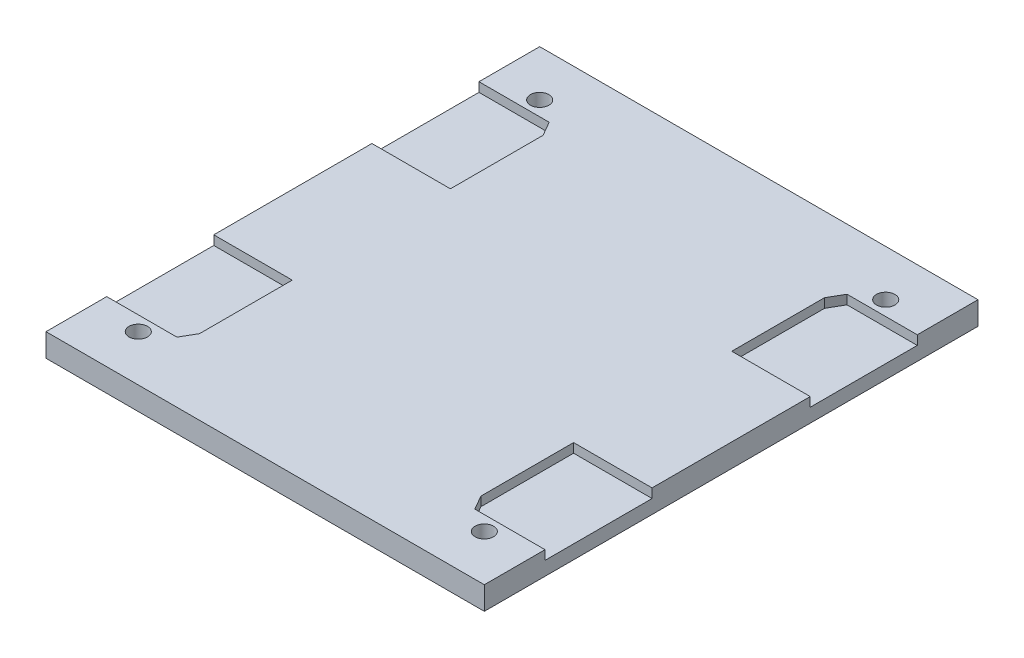
ISO-10303-21;
HEADER;
FILE_DESCRIPTION(('STEP AP214'),'2;1');
FILE_NAME('part.step','',(''),(''),'','','');
FILE_SCHEMA(('AUTOMOTIVE_DESIGN { 1 0 10303 214 1 1 1 1 }'));
ENDSEC;
DATA;
#1=APPLICATION_CONTEXT('core data for automotive mechanical design processes');
#2=APPLICATION_PROTOCOL_DEFINITION('international standard','automotive_design',2000,#1);
#3=PRODUCT_CONTEXT('',#1,'mechanical');
#4=PRODUCT('Part','Part','',(#3));
#5=PRODUCT_RELATED_PRODUCT_CATEGORY('part','',(#4));
#6=PRODUCT_DEFINITION_FORMATION('','',#4);
#7=PRODUCT_DEFINITION_CONTEXT('part definition',#1,'design');
#8=PRODUCT_DEFINITION('design','',#6,#7);
#9=PRODUCT_DEFINITION_SHAPE('','',#8);
#10=(LENGTH_UNIT() NAMED_UNIT(*) SI_UNIT(.MILLI.,.METRE.));
#11=(NAMED_UNIT(*) PLANE_ANGLE_UNIT() SI_UNIT($,.RADIAN.));
#12=(NAMED_UNIT(*) SI_UNIT($,.STERADIAN.) SOLID_ANGLE_UNIT());
#13=UNCERTAINTY_MEASURE_WITH_UNIT(LENGTH_MEASURE(1.E-05),#10,'distance_accuracy_value','');
#14=(GEOMETRIC_REPRESENTATION_CONTEXT(3) GLOBAL_UNCERTAINTY_ASSIGNED_CONTEXT((#13)) GLOBAL_UNIT_ASSIGNED_CONTEXT((#10,
#11,#12)) REPRESENTATION_CONTEXT('',''));
#15=CARTESIAN_POINT('',(0.,0.,0.));
#16=DIRECTION('',(0.,0.,1.));
#17=DIRECTION('',(1.,0.,0.));
#18=AXIS2_PLACEMENT_3D('',#15,#16,#17);
#19=CARTESIAN_POINT('',(47.5,5.,0.));
#20=DIRECTION('',(-1.,0.,0.));
#21=DIRECTION('',(0.,0.,1.));
#22=AXIS2_PLACEMENT_3D('',#19,#20,#21);
#23=PLANE('',#22);
#24=DIRECTION('',(0.,1.,0.));
#25=VECTOR('',#24,1.);
#26=CARTESIAN_POINT('',(47.5,3.,40.337063088207));
#27=LINE('',#26,#25);
#28=CARTESIAN_POINT('',(47.5,3.,40.337063088207));
#29=VERTEX_POINT('',#28);
#30=CARTESIAN_POINT('',(47.5,5.,40.337063088207));
#31=VERTEX_POINT('',#30);
#32=EDGE_CURVE('E249',#29,#31,#27,.T.);
#33=ORIENTED_EDGE('',*,*,#32,.T.);
#34=DIRECTION('',(0.,0.,-1.));
#35=VECTOR('',#34,1.);
#36=CARTESIAN_POINT('',(47.5,5.,0.));
#37=LINE('',#36,#35);
#38=CARTESIAN_POINT('',(47.5,5.,53.5));
#39=VERTEX_POINT('',#38);
#40=EDGE_CURVE('E348',#39,#31,#37,.T.);
#41=ORIENTED_EDGE('',*,*,#40,.F.);
#42=DIRECTION('',(0.,-1.,0.));
#43=VECTOR('',#42,1.);
#44=CARTESIAN_POINT('',(47.5,5.,53.5));
#45=LINE('',#44,#43);
#46=CARTESIAN_POINT('',(47.5,0.,53.5));
#47=VERTEX_POINT('',#46);
#48=EDGE_CURVE('E11',#39,#47,#45,.T.);
#49=ORIENTED_EDGE('',*,*,#48,.T.);
#50=DIRECTION('',(0.,0.,-1.));
#51=VECTOR('',#50,1.);
#52=CARTESIAN_POINT('',(47.5,0.,0.));
#53=LINE('',#52,#51);
#54=CARTESIAN_POINT('',(47.5,0.,-53.5));
#55=VERTEX_POINT('',#54);
#56=EDGE_CURVE('E375',#47,#55,#53,.T.);
#57=ORIENTED_EDGE('',*,*,#56,.T.);
#58=DIRECTION('',(0.,-1.,0.));
#59=VECTOR('',#58,1.);
#60=CARTESIAN_POINT('',(47.5,5.,-53.5));
#61=LINE('',#60,#59);
#62=CARTESIAN_POINT('',(47.5,5.,-53.5));
#63=VERTEX_POINT('',#62);
#64=EDGE_CURVE('E46',#63,#55,#61,.T.);
#65=ORIENTED_EDGE('',*,*,#64,.F.);
#66=CARTESIAN_POINT('',(47.5,5.,-40.337063088207));
#67=VERTEX_POINT('',#66);
#68=EDGE_CURVE('E226',#67,#63,#37,.T.);
#69=ORIENTED_EDGE('',*,*,#68,.F.);
#70=DIRECTION('',(0.,1.,0.));
#71=VECTOR('',#70,1.);
#72=CARTESIAN_POINT('',(47.5,3.,-40.337063088207));
#73=LINE('',#72,#71);
#74=CARTESIAN_POINT('',(47.5,3.,-40.337063088207));
#75=VERTEX_POINT('',#74);
#76=EDGE_CURVE('E205',#75,#67,#73,.T.);
#77=ORIENTED_EDGE('',*,*,#76,.F.);
#78=DIRECTION('',(0.,0.,-1.));
#79=VECTOR('',#78,1.);
#80=CARTESIAN_POINT('',(47.5,3.,0.));
#81=LINE('',#80,#79);
#82=CARTESIAN_POINT('',(47.5,3.,-17.1401594634259));
#83=VERTEX_POINT('',#82);
#84=EDGE_CURVE('E212',#83,#75,#81,.T.);
#85=ORIENTED_EDGE('',*,*,#84,.F.);
#86=DIRECTION('',(0.,1.,0.));
#87=VECTOR('',#86,1.);
#88=CARTESIAN_POINT('',(47.5,3.,-17.1401594634259));
#89=LINE('',#88,#87);
#90=CARTESIAN_POINT('',(47.5,5.,-17.1401594634259));
#91=VERTEX_POINT('',#90);
#92=EDGE_CURVE('E325',#83,#91,#89,.T.);
#93=ORIENTED_EDGE('',*,*,#92,.T.);
#94=CARTESIAN_POINT('',(47.5,5.,17.1401594634259));
#95=VERTEX_POINT('',#94);
#96=EDGE_CURVE('E352',#95,#91,#37,.T.);
#97=ORIENTED_EDGE('',*,*,#96,.F.);
#98=DIRECTION('',(0.,1.,0.));
#99=VECTOR('',#98,1.);
#100=CARTESIAN_POINT('',(47.5,3.,17.1401594634259));
#101=LINE('',#100,#99);
#102=CARTESIAN_POINT('',(47.5,3.,17.1401594634259));
#103=VERTEX_POINT('',#102);
#104=EDGE_CURVE('E270',#103,#95,#101,.T.);
#105=ORIENTED_EDGE('',*,*,#104,.F.);
#106=DIRECTION('',(0.,0.,-1.));
#107=VECTOR('',#106,1.);
#108=CARTESIAN_POINT('',(47.5,3.,0.));
#109=LINE('',#108,#107);
#110=EDGE_CURVE('E237',#29,#103,#109,.T.);
#111=ORIENTED_EDGE('',*,*,#110,.F.);
#112=EDGE_LOOP('',(#33,#41,#49,#57,#65,#69,#77,#85,#93,#97,#105,#111));
#113=FACE_BOUND('',#112,.T.);
#114=ADVANCED_FACE('F38',(#113),#23,.F.);
#115=CARTESIAN_POINT('',(-47.5,5.,0.));
#116=DIRECTION('',(-1.,0.,0.));
#117=DIRECTION('',(0.,0.,1.));
#118=AXIS2_PLACEMENT_3D('',#115,#116,#117);
#119=PLANE('',#118);
#120=DIRECTION('',(0.,0.,1.));
#121=VECTOR('',#120,1.);
#122=CARTESIAN_POINT('',(-47.5,3.,0.));
#123=LINE('',#122,#121);
#124=CARTESIAN_POINT('',(-47.5,3.,17.1401594634259));
#125=VERTEX_POINT('',#124);
#126=CARTESIAN_POINT('',(-47.5,3.,40.3370630882075));
#127=VERTEX_POINT('',#126);
#128=EDGE_CURVE('E276',#125,#127,#123,.T.);
#129=ORIENTED_EDGE('',*,*,#128,.F.);
#130=DIRECTION('',(0.,1.,0.));
#131=VECTOR('',#130,1.);
#132=CARTESIAN_POINT('',(-47.5,3.,17.1401594634259));
#133=LINE('',#132,#131);
#134=CARTESIAN_POINT('',(-47.5,5.,17.1401594634259));
#135=VERTEX_POINT('',#134);
#136=EDGE_CURVE('E288',#125,#135,#133,.T.);
#137=ORIENTED_EDGE('',*,*,#136,.T.);
#138=DIRECTION('',(0.,0.,-1.));
#139=VECTOR('',#138,1.);
#140=CARTESIAN_POINT('',(-47.5,5.,0.));
#141=LINE('',#140,#139);
#142=CARTESIAN_POINT('',(-47.5,5.,-17.1401594634259));
#143=VERTEX_POINT('',#142);
#144=EDGE_CURVE('E360',#135,#143,#141,.T.);
#145=ORIENTED_EDGE('',*,*,#144,.T.);
#146=DIRECTION('',(0.,1.,0.));
#147=VECTOR('',#146,1.);
#148=CARTESIAN_POINT('',(-47.5,3.,-17.1401594634259));
#149=LINE('',#148,#147);
#150=CARTESIAN_POINT('',(-47.5,3.,-17.1401594634259));
#151=VERTEX_POINT('',#150);
#152=EDGE_CURVE('E53',#151,#143,#149,.T.);
#153=ORIENTED_EDGE('',*,*,#152,.F.);
#154=DIRECTION('',(0.,0.,1.));
#155=VECTOR('',#154,1.);
#156=CARTESIAN_POINT('',(-47.5,3.,0.));
#157=LINE('',#156,#155);
#158=CARTESIAN_POINT('',(-47.5,3.,-40.3370630882075));
#159=VERTEX_POINT('',#158);
#160=EDGE_CURVE('E308',#159,#151,#157,.T.);
#161=ORIENTED_EDGE('',*,*,#160,.F.);
#162=DIRECTION('',(0.,1.,0.));
#163=VECTOR('',#162,1.);
#164=CARTESIAN_POINT('',(-47.5,3.,-40.3370630882075));
#165=LINE('',#164,#163);
#166=CARTESIAN_POINT('',(-47.5,5.,-40.3370630882075));
#167=VERTEX_POINT('',#166);
#168=EDGE_CURVE('E333',#159,#167,#165,.T.);
#169=ORIENTED_EDGE('',*,*,#168,.T.);
#170=CARTESIAN_POINT('',(-47.5,5.,-53.5));
#171=VERTEX_POINT('',#170);
#172=EDGE_CURVE('E355',#167,#171,#141,.T.);
#173=ORIENTED_EDGE('',*,*,#172,.T.);
#174=DIRECTION('',(0.,-1.,0.));
#175=VECTOR('',#174,1.);
#176=CARTESIAN_POINT('',(-47.5,5.,-53.5));
#177=LINE('',#176,#175);
#178=CARTESIAN_POINT('',(-47.5,0.,-53.5));
#179=VERTEX_POINT('',#178);
#180=EDGE_CURVE('E396',#171,#179,#177,.T.);
#181=ORIENTED_EDGE('',*,*,#180,.T.);
#182=DIRECTION('',(0.,0.,-1.));
#183=VECTOR('',#182,1.);
#184=CARTESIAN_POINT('',(-47.5,0.,0.));
#185=LINE('',#184,#183);
#186=CARTESIAN_POINT('',(-47.5,0.,53.5));
#187=VERTEX_POINT('',#186);
#188=EDGE_CURVE('E381',#187,#179,#185,.T.);
#189=ORIENTED_EDGE('',*,*,#188,.F.);
#190=DIRECTION('',(0.,-1.,0.));
#191=VECTOR('',#190,1.);
#192=CARTESIAN_POINT('',(-47.5,5.,53.5));
#193=LINE('',#192,#191);
#194=CARTESIAN_POINT('',(-47.5,5.,53.5));
#195=VERTEX_POINT('',#194);
#196=EDGE_CURVE('E372',#195,#187,#193,.T.);
#197=ORIENTED_EDGE('',*,*,#196,.F.);
#198=CARTESIAN_POINT('',(-47.5,5.,40.3370630882075));
#199=VERTEX_POINT('',#198);
#200=EDGE_CURVE('E356',#195,#199,#141,.T.);
#201=ORIENTED_EDGE('',*,*,#200,.T.);
#202=DIRECTION('',(0.,1.,0.));
#203=VECTOR('',#202,1.);
#204=CARTESIAN_POINT('',(-47.5,3.,40.3370630882075));
#205=LINE('',#204,#203);
#206=EDGE_CURVE('E61',#127,#199,#205,.T.);
#207=ORIENTED_EDGE('',*,*,#206,.F.);
#208=EDGE_LOOP('',(#129,#137,#145,#153,#161,#169,#173,#181,#189,#197,#201,#207));
#209=FACE_BOUND('',#208,.T.);
#210=ADVANCED_FACE('F410',(#209),#119,.T.);
#211=CARTESIAN_POINT('',(0.,5.,0.));
#212=DIRECTION('',(0.,1.,0.));
#213=DIRECTION('',(0.,0.,1.));
#214=AXIS2_PLACEMENT_3D('',#211,#212,#213);
#215=PLANE('',#214);
#216=CARTESIAN_POINT('',(-37.5,5.,-43.5));
#217=DIRECTION('',(0.,1.,0.));
#218=DIRECTION('',(0.,0.,1.));
#219=AXIS2_PLACEMENT_3D('',#216,#217,#218);
#220=CIRCLE('',#219,2.);
#221=CARTESIAN_POINT('',(-37.5,5.,-41.5));
#222=VERTEX_POINT('',#221);
#223=EDGE_CURVE('E359',#222,#222,#220,.T.);
#224=ORIENTED_EDGE('',*,*,#223,.F.);
#225=EDGE_LOOP('',(#224));
#226=FACE_BOUND('',#225,.T.);
#227=CARTESIAN_POINT('',(37.5,5.,-43.5));
#228=DIRECTION('',(0.,1.,0.));
#229=DIRECTION('',(0.,0.,1.));
#230=AXIS2_PLACEMENT_3D('',#227,#228,#229);
#231=CIRCLE('',#230,2.);
#232=CARTESIAN_POINT('',(37.5,5.,-41.5));
#233=VERTEX_POINT('',#232);
#234=EDGE_CURVE('E363',#233,#233,#231,.F.);
#235=ORIENTED_EDGE('',*,*,#234,.T.);
#236=EDGE_LOOP('',(#235));
#237=FACE_BOUND('',#236,.T.);
#238=CARTESIAN_POINT('',(37.5,5.,43.5));
#239=DIRECTION('',(0.,1.,0.));
#240=DIRECTION('',(0.,0.,1.));
#241=AXIS2_PLACEMENT_3D('',#238,#239,#240);
#242=CIRCLE('',#241,2.);
#243=CARTESIAN_POINT('',(37.5,5.,45.5));
#244=VERTEX_POINT('',#243);
#245=EDGE_CURVE('E366',#244,#244,#242,.T.);
#246=ORIENTED_EDGE('',*,*,#245,.F.);
#247=EDGE_LOOP('',(#246));
#248=FACE_BOUND('',#247,.T.);
#249=CARTESIAN_POINT('',(-37.5,5.,43.5));
#250=DIRECTION('',(0.,1.,0.));
#251=DIRECTION('',(0.,0.,1.));
#252=AXIS2_PLACEMENT_3D('',#249,#250,#251);
#253=CIRCLE('',#252,2.);
#254=CARTESIAN_POINT('',(-37.5,5.,45.5));
#255=VERTEX_POINT('',#254);
#256=EDGE_CURVE('E369',#255,#255,#253,.F.);
#257=ORIENTED_EDGE('',*,*,#256,.T.);
#258=EDGE_LOOP('',(#257));
#259=FACE_BOUND('',#258,.T.);
#260=ORIENTED_EDGE('',*,*,#144,.F.);
#261=DIRECTION('',(1.,0.,0.));
#262=VECTOR('',#261,1.);
#263=CARTESIAN_POINT('',(0.,5.,17.1401594634259));
#264=LINE('',#263,#262);
#265=CARTESIAN_POINT('',(-30.489963443197,5.,17.1401594634259));
#266=VERTEX_POINT('',#265);
#267=EDGE_CURVE('E289',#135,#266,#264,.T.);
#268=ORIENTED_EDGE('',*,*,#267,.T.);
#269=DIRECTION('',(0.,0.,1.));
#270=VECTOR('',#269,1.);
#271=CARTESIAN_POINT('',(-30.489963443197,5.,0.));
#272=LINE('',#271,#270);
#273=CARTESIAN_POINT('',(-30.489963443197,5.,37.232769094159));
#274=VERTEX_POINT('',#273);
#275=EDGE_CURVE('E277',#266,#274,#272,.T.);
#276=ORIENTED_EDGE('',*,*,#275,.T.);
#277=DIRECTION('',(0.500000000000003,0.,-0.866025403784437));
#278=VECTOR('',#277,1.);
#279=CARTESIAN_POINT('',(-6.74521063800667,5.,-3.8943491775939));
#280=LINE('',#279,#278);
#281=CARTESIAN_POINT('',(-32.2822284162783,5.,40.337063088162));
#282=VERTEX_POINT('',#281);
#283=EDGE_CURVE('E294',#282,#274,#280,.T.);
#284=ORIENTED_EDGE('',*,*,#283,.F.);
#285=DIRECTION('',(1.,0.,-5.93878153770729E-12));
#286=VECTOR('',#285,1.);
#287=CARTESIAN_POINT('',(2.39553005552172E-10,5.,40.3370630879703));
#288=LINE('',#287,#286);
#289=EDGE_CURVE('E292',#199,#282,#288,.T.);
#290=ORIENTED_EDGE('',*,*,#289,.F.);
#291=ORIENTED_EDGE('',*,*,#200,.F.);
#292=DIRECTION('',(1.,0.,0.));
#293=VECTOR('',#292,1.);
#294=CARTESIAN_POINT('',(0.,5.,53.5));
#295=LINE('',#294,#293);
#296=EDGE_CURVE('E344',#195,#39,#295,.T.);
#297=ORIENTED_EDGE('',*,*,#296,.T.);
#298=ORIENTED_EDGE('',*,*,#40,.T.);
#299=DIRECTION('',(-1.,0.,-5.96188434918114E-12));
#300=VECTOR('',#299,1.);
#301=CARTESIAN_POINT('',(-2.40484905116095E-10,5.,40.3370630879691));
#302=LINE('',#301,#300);
#303=CARTESIAN_POINT('',(32.2822284163111,5.,40.3370630881616));
#304=VERTEX_POINT('',#303);
#305=EDGE_CURVE('E250',#31,#304,#302,.T.);
#306=ORIENTED_EDGE('',*,*,#305,.T.);
#307=DIRECTION('',(-0.5,0.,-0.866025403784439));
#308=VECTOR('',#307,1.);
#309=CARTESIAN_POINT('',(6.74521063803161,5.,-3.89434917760827));
#310=LINE('',#309,#308);
#311=CARTESIAN_POINT('',(30.48996344323,5.,37.232769094159));
#312=VERTEX_POINT('',#311);
#313=EDGE_CURVE('E238',#304,#312,#310,.T.);
#314=ORIENTED_EDGE('',*,*,#313,.T.);
#315=DIRECTION('',(0.,0.,1.));
#316=VECTOR('',#315,1.);
#317=CARTESIAN_POINT('',(30.48996344323,5.,0.));
#318=LINE('',#317,#316);
#319=CARTESIAN_POINT('',(30.48996344323,5.,17.1401594634259));
#320=VERTEX_POINT('',#319);
#321=EDGE_CURVE('E257',#320,#312,#318,.T.);
#322=ORIENTED_EDGE('',*,*,#321,.F.);
#323=DIRECTION('',(-1.,0.,0.));
#324=VECTOR('',#323,1.);
#325=CARTESIAN_POINT('',(0.,5.,17.1401594634259));
#326=LINE('',#325,#324);
#327=EDGE_CURVE('E253',#95,#320,#326,.T.);
#328=ORIENTED_EDGE('',*,*,#327,.F.);
#329=ORIENTED_EDGE('',*,*,#96,.T.);
#330=DIRECTION('',(-1.,0.,0.));
#331=VECTOR('',#330,1.);
#332=CARTESIAN_POINT('',(0.,5.,-17.1401594634259));
#333=LINE('',#332,#331);
#334=CARTESIAN_POINT('',(30.48996344323,5.,-17.1401594634259));
#335=VERTEX_POINT('',#334);
#336=EDGE_CURVE('E221',#91,#335,#333,.T.);
#337=ORIENTED_EDGE('',*,*,#336,.T.);
#338=DIRECTION('',(0.,0.,-1.));
#339=VECTOR('',#338,1.);
#340=CARTESIAN_POINT('',(30.48996344323,5.,0.));
#341=LINE('',#340,#339);
#342=CARTESIAN_POINT('',(30.48996344323,5.,-37.232769094159));
#343=VERTEX_POINT('',#342);
#344=EDGE_CURVE('E437',#335,#343,#341,.T.);
#345=ORIENTED_EDGE('',*,*,#344,.T.);
#346=DIRECTION('',(-0.5,0.,0.866025403784439));
#347=VECTOR('',#346,1.);
#348=CARTESIAN_POINT('',(6.74521063803161,5.,3.89434917760827));
#349=LINE('',#348,#347);
#350=CARTESIAN_POINT('',(32.2822284163111,5.,-40.3370630881616));
#351=VERTEX_POINT('',#350);
#352=EDGE_CURVE('E439',#351,#343,#349,.T.);
#353=ORIENTED_EDGE('',*,*,#352,.F.);
#354=DIRECTION('',(-1.,0.,5.96188434918114E-12));
#355=VECTOR('',#354,1.);
#356=CARTESIAN_POINT('',(-2.40484905116095E-10,5.,-40.3370630879691));
#357=LINE('',#356,#355);
#358=EDGE_CURVE('E265',#67,#351,#357,.T.);
#359=ORIENTED_EDGE('',*,*,#358,.F.);
#360=ORIENTED_EDGE('',*,*,#68,.T.);
#361=DIRECTION('',(1.,0.,0.));
#362=VECTOR('',#361,1.);
#363=CARTESIAN_POINT('',(0.,5.,-53.5));
#364=LINE('',#363,#362);
#365=EDGE_CURVE('E351',#171,#63,#364,.T.);
#366=ORIENTED_EDGE('',*,*,#365,.F.);
#367=ORIENTED_EDGE('',*,*,#172,.F.);
#368=DIRECTION('',(1.,0.,5.93878153770729E-12));
#369=VECTOR('',#368,1.);
#370=CARTESIAN_POINT('',(2.39553005552172E-10,5.,-40.3370630879703));
#371=LINE('',#370,#369);
#372=CARTESIAN_POINT('',(-32.2822284162783,5.,-40.337063088162));
#373=VERTEX_POINT('',#372);
#374=EDGE_CURVE('E312',#167,#373,#371,.T.);
#375=ORIENTED_EDGE('',*,*,#374,.T.);
#376=DIRECTION('',(0.500000000000003,0.,0.866025403784437));
#377=VECTOR('',#376,1.);
#378=CARTESIAN_POINT('',(-6.74521063800667,5.,3.8943491775939));
#379=LINE('',#378,#377);
#380=CARTESIAN_POINT('',(-30.489963443197,5.,-37.232769094159));
#381=VERTEX_POINT('',#380);
#382=EDGE_CURVE('E328',#373,#381,#379,.T.);
#383=ORIENTED_EDGE('',*,*,#382,.T.);
#384=DIRECTION('',(0.,0.,-1.));
#385=VECTOR('',#384,1.);
#386=CARTESIAN_POINT('',(-30.489963443197,5.,0.));
#387=LINE('',#386,#385);
#388=CARTESIAN_POINT('',(-30.489963443197,5.,-17.1401594634259));
#389=VERTEX_POINT('',#388);
#390=EDGE_CURVE('E324',#389,#381,#387,.T.);
#391=ORIENTED_EDGE('',*,*,#390,.F.);
#392=DIRECTION('',(1.,0.,0.));
#393=VECTOR('',#392,1.);
#394=CARTESIAN_POINT('',(0.,5.,-17.1401594634259));
#395=LINE('',#394,#393);
#396=EDGE_CURVE('E322',#143,#389,#395,.T.);
#397=ORIENTED_EDGE('',*,*,#396,.F.);
#398=EDGE_LOOP('',(#260,#268,#276,#284,#290,#291,#297,#298,#306,#314,#322,#328,#329,#337,#345,
#353,#359,#360,#366,#367,#375,#383,#391,#397));
#399=FACE_BOUND('',#398,.T.);
#400=ADVANCED_FACE('F415',(#226,#237,#248,#259,#399),#215,.T.);
#401=CARTESIAN_POINT('',(0.,5.,53.5));
#402=DIRECTION('',(0.,0.,-1.));
#403=DIRECTION('',(-1.,0.,0.));
#404=AXIS2_PLACEMENT_3D('',#401,#402,#403);
#405=PLANE('',#404);
#406=DIRECTION('',(1.,0.,0.));
#407=VECTOR('',#406,1.);
#408=CARTESIAN_POINT('',(0.,0.,53.5));
#409=LINE('',#408,#407);
#410=EDGE_CURVE('E336',#187,#47,#409,.T.);
#411=ORIENTED_EDGE('',*,*,#410,.T.);
#412=ORIENTED_EDGE('',*,*,#48,.F.);
#413=ORIENTED_EDGE('',*,*,#296,.F.);
#414=ORIENTED_EDGE('',*,*,#196,.T.);
#415=EDGE_LOOP('',(#411,#412,#413,#414));
#416=FACE_BOUND('',#415,.T.);
#417=ADVANCED_FACE('F40',(#416),#405,.F.);
#418=CARTESIAN_POINT('',(0.,5.,-53.5));
#419=DIRECTION('',(0.,0.,-1.));
#420=DIRECTION('',(-1.,0.,0.));
#421=AXIS2_PLACEMENT_3D('',#418,#419,#420);
#422=PLANE('',#421);
#423=DIRECTION('',(1.,0.,0.));
#424=VECTOR('',#423,1.);
#425=CARTESIAN_POINT('',(0.,0.,-53.5));
#426=LINE('',#425,#424);
#427=EDGE_CURVE('E378',#179,#55,#426,.T.);
#428=ORIENTED_EDGE('',*,*,#427,.F.);
#429=ORIENTED_EDGE('',*,*,#180,.F.);
#430=ORIENTED_EDGE('',*,*,#365,.T.);
#431=ORIENTED_EDGE('',*,*,#64,.T.);
#432=EDGE_LOOP('',(#428,#429,#430,#431));
#433=FACE_BOUND('',#432,.T.);
#434=ADVANCED_FACE('F399',(#433),#422,.T.);
#435=CARTESIAN_POINT('',(37.5,5.,43.5));
#436=DIRECTION('',(0.,-1.,0.));
#437=DIRECTION('',(0.,0.,-1.));
#438=AXIS2_PLACEMENT_3D('',#435,#436,#437);
#439=CYLINDRICAL_SURFACE('',#438,2.);
#440=ORIENTED_EDGE('',*,*,#245,.T.);
#441=EDGE_LOOP('',(#440));
#442=FACE_BOUND('',#441,.T.);
#443=CARTESIAN_POINT('',(37.5,0.,43.5));
#444=DIRECTION('',(0.,1.,0.));
#445=DIRECTION('',(0.,0.,1.));
#446=AXIS2_PLACEMENT_3D('',#443,#444,#445);
#447=CIRCLE('',#446,2.);
#448=CARTESIAN_POINT('',(37.5,0.,45.5));
#449=VERTEX_POINT('',#448);
#450=EDGE_CURVE('E390',#449,#449,#447,.T.);
#451=ORIENTED_EDGE('',*,*,#450,.F.);
#452=EDGE_LOOP('',(#451));
#453=FACE_BOUND('',#452,.T.);
#454=ADVANCED_FACE('F461',(#442,#453),#439,.F.);
#455=CARTESIAN_POINT('',(37.5,5.,-43.5));
#456=DIRECTION('',(0.,-1.,0.));
#457=DIRECTION('',(0.,0.,-1.));
#458=AXIS2_PLACEMENT_3D('',#455,#456,#457);
#459=CYLINDRICAL_SURFACE('',#458,2.);
#460=ORIENTED_EDGE('',*,*,#234,.F.);
#461=EDGE_LOOP('',(#460));
#462=FACE_BOUND('',#461,.T.);
#463=CARTESIAN_POINT('',(37.5,0.,-43.5));
#464=DIRECTION('',(0.,1.,0.));
#465=DIRECTION('',(0.,0.,1.));
#466=AXIS2_PLACEMENT_3D('',#463,#464,#465);
#467=CIRCLE('',#466,2.);
#468=CARTESIAN_POINT('',(37.5,0.,-41.5));
#469=VERTEX_POINT('',#468);
#470=EDGE_CURVE('E387',#469,#469,#467,.F.);
#471=ORIENTED_EDGE('',*,*,#470,.T.);
#472=EDGE_LOOP('',(#471));
#473=FACE_BOUND('',#472,.T.);
#474=ADVANCED_FACE('F467',(#462,#473),#459,.F.);
#475=CARTESIAN_POINT('',(-37.5,5.,-43.5));
#476=DIRECTION('',(0.,-1.,0.));
#477=DIRECTION('',(0.,0.,-1.));
#478=AXIS2_PLACEMENT_3D('',#475,#476,#477);
#479=CYLINDRICAL_SURFACE('',#478,2.);
#480=ORIENTED_EDGE('',*,*,#223,.T.);
#481=EDGE_LOOP('',(#480));
#482=FACE_BOUND('',#481,.T.);
#483=CARTESIAN_POINT('',(-37.5,0.,-43.5));
#484=DIRECTION('',(0.,1.,0.));
#485=DIRECTION('',(0.,0.,1.));
#486=AXIS2_PLACEMENT_3D('',#483,#484,#485);
#487=CIRCLE('',#486,2.);
#488=CARTESIAN_POINT('',(-37.5,0.,-41.5));
#489=VERTEX_POINT('',#488);
#490=EDGE_CURVE('E384',#489,#489,#487,.T.);
#491=ORIENTED_EDGE('',*,*,#490,.F.);
#492=EDGE_LOOP('',(#491));
#493=FACE_BOUND('',#492,.T.);
#494=ADVANCED_FACE('F463',(#482,#493),#479,.F.);
#495=CARTESIAN_POINT('',(-37.5,5.,43.5));
#496=DIRECTION('',(0.,-1.,0.));
#497=DIRECTION('',(0.,0.,-1.));
#498=AXIS2_PLACEMENT_3D('',#495,#496,#497);
#499=CYLINDRICAL_SURFACE('',#498,2.);
#500=ORIENTED_EDGE('',*,*,#256,.F.);
#501=EDGE_LOOP('',(#500));
#502=FACE_BOUND('',#501,.T.);
#503=CARTESIAN_POINT('',(-37.5,0.,43.5));
#504=DIRECTION('',(0.,1.,0.));
#505=DIRECTION('',(0.,0.,1.));
#506=AXIS2_PLACEMENT_3D('',#503,#504,#505);
#507=CIRCLE('',#506,2.);
#508=CARTESIAN_POINT('',(-37.5,0.,45.5));
#509=VERTEX_POINT('',#508);
#510=EDGE_CURVE('E347',#509,#509,#507,.F.);
#511=ORIENTED_EDGE('',*,*,#510,.T.);
#512=EDGE_LOOP('',(#511));
#513=FACE_BOUND('',#512,.T.);
#514=ADVANCED_FACE('F466',(#502,#513),#499,.F.);
#515=CARTESIAN_POINT('',(0.,0.,0.));
#516=DIRECTION('',(0.,1.,0.));
#517=DIRECTION('',(0.,0.,1.));
#518=AXIS2_PLACEMENT_3D('',#515,#516,#517);
#519=PLANE('',#518);
#520=ORIENTED_EDGE('',*,*,#410,.F.);
#521=ORIENTED_EDGE('',*,*,#188,.T.);
#522=ORIENTED_EDGE('',*,*,#427,.T.);
#523=ORIENTED_EDGE('',*,*,#56,.F.);
#524=EDGE_LOOP('',(#520,#521,#522,#523));
#525=FACE_BOUND('',#524,.T.);
#526=ORIENTED_EDGE('',*,*,#490,.T.);
#527=EDGE_LOOP('',(#526));
#528=FACE_BOUND('',#527,.T.);
#529=ORIENTED_EDGE('',*,*,#470,.F.);
#530=EDGE_LOOP('',(#529));
#531=FACE_BOUND('',#530,.T.);
#532=ORIENTED_EDGE('',*,*,#450,.T.);
#533=EDGE_LOOP('',(#532));
#534=FACE_BOUND('',#533,.T.);
#535=ORIENTED_EDGE('',*,*,#510,.F.);
#536=EDGE_LOOP('',(#535));
#537=FACE_BOUND('',#536,.T.);
#538=ADVANCED_FACE('F405',(#525,#528,#531,#534,#537),#519,.F.);
#539=CARTESIAN_POINT('',(2.39553005552172E-10,3.,-40.3370630879703));
#540=DIRECTION('',(-5.93878153770729E-12,0.,1.));
#541=DIRECTION('',(1.,0.,5.93878153770729E-12));
#542=AXIS2_PLACEMENT_3D('',#539,#540,#541);
#543=PLANE('',#542);
#544=ORIENTED_EDGE('',*,*,#374,.F.);
#545=ORIENTED_EDGE('',*,*,#168,.F.);
#546=DIRECTION('',(1.,0.,5.93878153770729E-12));
#547=VECTOR('',#546,1.);
#548=CARTESIAN_POINT('',(2.39553005552172E-10,3.,-40.3370630879703));
#549=LINE('',#548,#547);
#550=CARTESIAN_POINT('',(-32.2822284162783,3.,-40.337063088162));
#551=VERTEX_POINT('',#550);
#552=EDGE_CURVE('E320',#159,#551,#549,.T.);
#553=ORIENTED_EDGE('',*,*,#552,.T.);
#554=DIRECTION('',(0.,1.,0.));
#555=VECTOR('',#554,1.);
#556=CARTESIAN_POINT('',(-32.2822284162783,3.,-40.337063088162));
#557=LINE('',#556,#555);
#558=EDGE_CURVE('E337',#551,#373,#557,.T.);
#559=ORIENTED_EDGE('',*,*,#558,.T.);
#560=EDGE_LOOP('',(#544,#545,#553,#559));
#561=FACE_BOUND('',#560,.T.);
#562=ADVANCED_FACE('F480',(#561),#543,.T.);
#563=CARTESIAN_POINT('',(-6.74521063800667,3.,3.8943491775939));
#564=DIRECTION('',(-0.866025403784437,0.,0.500000000000003));
#565=DIRECTION('',(0.500000000000003,0.,0.866025403784437));
#566=AXIS2_PLACEMENT_3D('',#563,#564,#565);
#567=PLANE('',#566);
#568=ORIENTED_EDGE('',*,*,#382,.F.);
#569=ORIENTED_EDGE('',*,*,#558,.F.);
#570=DIRECTION('',(0.500000000000003,0.,0.866025403784437));
#571=VECTOR('',#570,1.);
#572=CARTESIAN_POINT('',(-6.74521063800667,3.,3.8943491775939));
#573=LINE('',#572,#571);
#574=CARTESIAN_POINT('',(-30.489963443197,3.,-37.232769094159));
#575=VERTEX_POINT('',#574);
#576=EDGE_CURVE('E318',#551,#575,#573,.T.);
#577=ORIENTED_EDGE('',*,*,#576,.T.);
#578=DIRECTION('',(0.,1.,0.));
#579=VECTOR('',#578,1.);
#580=CARTESIAN_POINT('',(-30.489963443197,3.,-37.232769094159));
#581=LINE('',#580,#579);
#582=EDGE_CURVE('E339',#575,#381,#581,.T.);
#583=ORIENTED_EDGE('',*,*,#582,.T.);
#584=EDGE_LOOP('',(#568,#569,#577,#583));
#585=FACE_BOUND('',#584,.T.);
#586=ADVANCED_FACE('F491',(#585),#567,.T.);
#587=CARTESIAN_POINT('',(-30.489963443197,3.,0.));
#588=DIRECTION('',(1.,0.,0.));
#589=DIRECTION('',(0.,0.,-1.));
#590=AXIS2_PLACEMENT_3D('',#587,#588,#589);
#591=PLANE('',#590);
#592=ORIENTED_EDGE('',*,*,#390,.T.);
#593=ORIENTED_EDGE('',*,*,#582,.F.);
#594=DIRECTION('',(0.,0.,-1.));
#595=VECTOR('',#594,1.);
#596=CARTESIAN_POINT('',(-30.489963443197,3.,0.));
#597=LINE('',#596,#595);
#598=CARTESIAN_POINT('',(-30.489963443197,3.,-17.1401594634259));
#599=VERTEX_POINT('',#598);
#600=EDGE_CURVE('E315',#599,#575,#597,.T.);
#601=ORIENTED_EDGE('',*,*,#600,.F.);
#602=DIRECTION('',(0.,1.,0.));
#603=VECTOR('',#602,1.);
#604=CARTESIAN_POINT('',(-30.489963443197,3.,-17.1401594634259));
#605=LINE('',#604,#603);
#606=EDGE_CURVE('E341',#599,#389,#605,.T.);
#607=ORIENTED_EDGE('',*,*,#606,.T.);
#608=EDGE_LOOP('',(#592,#593,#601,#607));
#609=FACE_BOUND('',#608,.T.);
#610=ADVANCED_FACE('F488',(#609),#591,.F.);
#611=CARTESIAN_POINT('',(0.,3.,-17.1401594634259));
#612=DIRECTION('',(0.,0.,1.));
#613=DIRECTION('',(1.,0.,0.));
#614=AXIS2_PLACEMENT_3D('',#611,#612,#613);
#615=PLANE('',#614);
#616=ORIENTED_EDGE('',*,*,#396,.T.);
#617=ORIENTED_EDGE('',*,*,#606,.F.);
#618=DIRECTION('',(1.,0.,0.));
#619=VECTOR('',#618,1.);
#620=CARTESIAN_POINT('',(0.,3.,-17.1401594634259));
#621=LINE('',#620,#619);
#622=EDGE_CURVE('E311',#151,#599,#621,.T.);
#623=ORIENTED_EDGE('',*,*,#622,.F.);
#624=ORIENTED_EDGE('',*,*,#152,.T.);
#625=EDGE_LOOP('',(#616,#617,#623,#624));
#626=FACE_BOUND('',#625,.T.);
#627=ADVANCED_FACE('F484',(#626),#615,.F.);
#628=CARTESIAN_POINT('',(0.,3.,0.));
#629=DIRECTION('',(0.,1.,0.));
#630=DIRECTION('',(0.,0.,1.));
#631=AXIS2_PLACEMENT_3D('',#628,#629,#630);
#632=PLANE('',#631);
#633=ORIENTED_EDGE('',*,*,#160,.T.);
#634=ORIENTED_EDGE('',*,*,#622,.T.);
#635=ORIENTED_EDGE('',*,*,#600,.T.);
#636=ORIENTED_EDGE('',*,*,#576,.F.);
#637=ORIENTED_EDGE('',*,*,#552,.F.);
#638=EDGE_LOOP('',(#633,#634,#635,#636,#637));
#639=FACE_BOUND('',#638,.T.);
#640=ADVANCED_FACE('F487',(#639),#632,.T.);
#641=CARTESIAN_POINT('',(0.,3.,-17.1401594634259));
#642=DIRECTION('',(0.,0.,-1.));
#643=DIRECTION('',(-1.,0.,0.));
#644=AXIS2_PLACEMENT_3D('',#641,#642,#643);
#645=PLANE('',#644);
#646=ORIENTED_EDGE('',*,*,#336,.F.);
#647=ORIENTED_EDGE('',*,*,#92,.F.);
#648=DIRECTION('',(-1.,0.,0.));
#649=VECTOR('',#648,1.);
#650=CARTESIAN_POINT('',(0.,3.,-17.1401594634259));
#651=LINE('',#650,#649);
#652=CARTESIAN_POINT('',(30.48996344323,3.,-17.1401594634259));
#653=VERTEX_POINT('',#652);
#654=EDGE_CURVE('E218',#83,#653,#651,.T.);
#655=ORIENTED_EDGE('',*,*,#654,.T.);
#656=DIRECTION('',(0.,1.,0.));
#657=VECTOR('',#656,1.);
#658=CARTESIAN_POINT('',(30.48996344323,3.,-17.1401594634259));
#659=LINE('',#658,#657);
#660=EDGE_CURVE('E426',#653,#335,#659,.T.);
#661=ORIENTED_EDGE('',*,*,#660,.T.);
#662=EDGE_LOOP('',(#646,#647,#655,#661));
#663=FACE_BOUND('',#662,.T.);
#664=ADVANCED_FACE('F452',(#663),#645,.T.);
#665=CARTESIAN_POINT('',(30.48996344323,3.,0.));
#666=DIRECTION('',(1.,0.,0.));
#667=DIRECTION('',(0.,0.,-1.));
#668=AXIS2_PLACEMENT_3D('',#665,#666,#667);
#669=PLANE('',#668);
#670=ORIENTED_EDGE('',*,*,#344,.F.);
#671=ORIENTED_EDGE('',*,*,#660,.F.);
#672=DIRECTION('',(0.,0.,-1.));
#673=VECTOR('',#672,1.);
#674=CARTESIAN_POINT('',(30.48996344323,3.,0.));
#675=LINE('',#674,#673);
#676=CARTESIAN_POINT('',(30.48996344323,3.,-37.232769094159));
#677=VERTEX_POINT('',#676);
#678=EDGE_CURVE('E230',#653,#677,#675,.T.);
#679=ORIENTED_EDGE('',*,*,#678,.T.);
#680=DIRECTION('',(0.,1.,0.));
#681=VECTOR('',#680,1.);
#682=CARTESIAN_POINT('',(30.48996344323,3.,-37.232769094159));
#683=LINE('',#682,#681);
#684=EDGE_CURVE('E228',#677,#343,#683,.T.);
#685=ORIENTED_EDGE('',*,*,#684,.T.);
#686=EDGE_LOOP('',(#670,#671,#679,#685));
#687=FACE_BOUND('',#686,.T.);
#688=ADVANCED_FACE('F435',(#687),#669,.T.);
#689=CARTESIAN_POINT('',(6.74521063803161,3.,3.89434917760827));
#690=DIRECTION('',(-0.866025403784439,0.,-0.5));
#691=DIRECTION('',(-0.5,0.,0.866025403784439));
#692=AXIS2_PLACEMENT_3D('',#689,#690,#691);
#693=PLANE('',#692);
#694=ORIENTED_EDGE('',*,*,#352,.T.);
#695=ORIENTED_EDGE('',*,*,#684,.F.);
#696=DIRECTION('',(-0.5,0.,0.866025403784439));
#697=VECTOR('',#696,1.);
#698=CARTESIAN_POINT('',(6.74521063803161,3.,3.89434917760827));
#699=LINE('',#698,#697);
#700=CARTESIAN_POINT('',(32.2822284163111,3.,-40.3370630881616));
#701=VERTEX_POINT('',#700);
#702=EDGE_CURVE('E211',#701,#677,#699,.T.);
#703=ORIENTED_EDGE('',*,*,#702,.F.);
#704=DIRECTION('',(0.,1.,0.));
#705=VECTOR('',#704,1.);
#706=CARTESIAN_POINT('',(32.2822284163111,3.,-40.3370630881616));
#707=LINE('',#706,#705);
#708=EDGE_CURVE('E207',#701,#351,#707,.T.);
#709=ORIENTED_EDGE('',*,*,#708,.T.);
#710=EDGE_LOOP('',(#694,#695,#703,#709));
#711=FACE_BOUND('',#710,.T.);
#712=ADVANCED_FACE('F440',(#711),#693,.F.);
#713=CARTESIAN_POINT('',(-2.40484905116095E-10,3.,-40.3370630879691));
#714=DIRECTION('',(-5.96188434918114E-12,0.,-1.));
#715=DIRECTION('',(-1.,0.,5.96188434918114E-12));
#716=AXIS2_PLACEMENT_3D('',#713,#714,#715);
#717=PLANE('',#716);
#718=ORIENTED_EDGE('',*,*,#358,.T.);
#719=ORIENTED_EDGE('',*,*,#708,.F.);
#720=DIRECTION('',(-1.,0.,5.96188434918114E-12));
#721=VECTOR('',#720,1.);
#722=CARTESIAN_POINT('',(-2.40484905116095E-10,3.,-40.3370630879691));
#723=LINE('',#722,#721);
#724=EDGE_CURVE('E200',#75,#701,#723,.T.);
#725=ORIENTED_EDGE('',*,*,#724,.F.);
#726=ORIENTED_EDGE('',*,*,#76,.T.);
#727=EDGE_LOOP('',(#718,#719,#725,#726));
#728=FACE_BOUND('',#727,.T.);
#729=ADVANCED_FACE('F203',(#728),#717,.F.);
#730=CARTESIAN_POINT('',(0.,3.,0.));
#731=DIRECTION('',(0.,1.,0.));
#732=DIRECTION('',(0.,0.,1.));
#733=AXIS2_PLACEMENT_3D('',#730,#731,#732);
#734=PLANE('',#733);
#735=ORIENTED_EDGE('',*,*,#84,.T.);
#736=ORIENTED_EDGE('',*,*,#724,.T.);
#737=ORIENTED_EDGE('',*,*,#702,.T.);
#738=ORIENTED_EDGE('',*,*,#678,.F.);
#739=ORIENTED_EDGE('',*,*,#654,.F.);
#740=EDGE_LOOP('',(#735,#736,#737,#738,#739));
#741=FACE_BOUND('',#740,.T.);
#742=ADVANCED_FACE('F216',(#741),#734,.T.);
#743=CARTESIAN_POINT('',(-2.40484905116095E-10,3.,40.3370630879691));
#744=DIRECTION('',(5.96188434918114E-12,0.,-1.));
#745=DIRECTION('',(-1.,0.,-5.96188434918114E-12));
#746=AXIS2_PLACEMENT_3D('',#743,#744,#745);
#747=PLANE('',#746);
#748=ORIENTED_EDGE('',*,*,#305,.F.);
#749=ORIENTED_EDGE('',*,*,#32,.F.);
#750=DIRECTION('',(-1.,0.,-5.96188434918114E-12));
#751=VECTOR('',#750,1.);
#752=CARTESIAN_POINT('',(-2.40484905116095E-10,3.,40.3370630879691));
#753=LINE('',#752,#751);
#754=CARTESIAN_POINT('',(32.2822284163111,3.,40.3370630881616));
#755=VERTEX_POINT('',#754);
#756=EDGE_CURVE('E234',#29,#755,#753,.T.);
#757=ORIENTED_EDGE('',*,*,#756,.T.);
#758=DIRECTION('',(0.,1.,0.));
#759=VECTOR('',#758,1.);
#760=CARTESIAN_POINT('',(32.2822284163111,3.,40.3370630881616));
#761=LINE('',#760,#759);
#762=EDGE_CURVE('E262',#755,#304,#761,.T.);
#763=ORIENTED_EDGE('',*,*,#762,.T.);
#764=EDGE_LOOP('',(#748,#749,#757,#763));
#765=FACE_BOUND('',#764,.T.);
#766=ADVANCED_FACE('F522',(#765),#747,.T.);
#767=CARTESIAN_POINT('',(6.74521063803161,3.,-3.89434917760827));
#768=DIRECTION('',(0.866025403784439,0.,-0.5));
#769=DIRECTION('',(-0.5,0.,-0.866025403784439));
#770=AXIS2_PLACEMENT_3D('',#767,#768,#769);
#771=PLANE('',#770);
#772=ORIENTED_EDGE('',*,*,#313,.F.);
#773=ORIENTED_EDGE('',*,*,#762,.F.);
#774=DIRECTION('',(-0.5,0.,-0.866025403784439));
#775=VECTOR('',#774,1.);
#776=CARTESIAN_POINT('',(6.74521063803161,3.,-3.89434917760827));
#777=LINE('',#776,#775);
#778=CARTESIAN_POINT('',(30.48996344323,3.,37.232769094159));
#779=VERTEX_POINT('',#778);
#780=EDGE_CURVE('E247',#755,#779,#777,.T.);
#781=ORIENTED_EDGE('',*,*,#780,.T.);
#782=DIRECTION('',(0.,1.,0.));
#783=VECTOR('',#782,1.);
#784=CARTESIAN_POINT('',(30.48996344323,3.,37.232769094159));
#785=LINE('',#784,#783);
#786=EDGE_CURVE('E266',#779,#312,#785,.T.);
#787=ORIENTED_EDGE('',*,*,#786,.T.);
#788=EDGE_LOOP('',(#772,#773,#781,#787));
#789=FACE_BOUND('',#788,.T.);
#790=ADVANCED_FACE('F525',(#789),#771,.T.);
#791=CARTESIAN_POINT('',(30.48996344323,3.,0.));
#792=DIRECTION('',(-1.,0.,0.));
#793=DIRECTION('',(0.,0.,1.));
#794=AXIS2_PLACEMENT_3D('',#791,#792,#793);
#795=PLANE('',#794);
#796=ORIENTED_EDGE('',*,*,#321,.T.);
#797=ORIENTED_EDGE('',*,*,#786,.F.);
#798=DIRECTION('',(0.,0.,1.));
#799=VECTOR('',#798,1.);
#800=CARTESIAN_POINT('',(30.48996344323,3.,0.));
#801=LINE('',#800,#799);
#802=CARTESIAN_POINT('',(30.48996344323,3.,17.1401594634259));
#803=VERTEX_POINT('',#802);
#804=EDGE_CURVE('E244',#803,#779,#801,.T.);
#805=ORIENTED_EDGE('',*,*,#804,.F.);
#806=DIRECTION('',(0.,1.,0.));
#807=VECTOR('',#806,1.);
#808=CARTESIAN_POINT('',(30.48996344323,3.,17.1401594634259));
#809=LINE('',#808,#807);
#810=EDGE_CURVE('E268',#803,#320,#809,.T.);
#811=ORIENTED_EDGE('',*,*,#810,.T.);
#812=EDGE_LOOP('',(#796,#797,#805,#811));
#813=FACE_BOUND('',#812,.T.);
#814=ADVANCED_FACE('F530',(#813),#795,.F.);
#815=CARTESIAN_POINT('',(0.,3.,17.1401594634259));
#816=DIRECTION('',(0.,0.,-1.));
#817=DIRECTION('',(-1.,0.,0.));
#818=AXIS2_PLACEMENT_3D('',#815,#816,#817);
#819=PLANE('',#818);
#820=ORIENTED_EDGE('',*,*,#327,.T.);
#821=ORIENTED_EDGE('',*,*,#810,.F.);
#822=DIRECTION('',(-1.,0.,0.));
#823=VECTOR('',#822,1.);
#824=CARTESIAN_POINT('',(0.,3.,17.1401594634259));
#825=LINE('',#824,#823);
#826=EDGE_CURVE('E241',#103,#803,#825,.T.);
#827=ORIENTED_EDGE('',*,*,#826,.F.);
#828=ORIENTED_EDGE('',*,*,#104,.T.);
#829=EDGE_LOOP('',(#820,#821,#827,#828));
#830=FACE_BOUND('',#829,.T.);
#831=ADVANCED_FACE('F527',(#830),#819,.F.);
#832=CARTESIAN_POINT('',(0.,3.,0.));
#833=DIRECTION('',(0.,1.,0.));
#834=DIRECTION('',(0.,0.,1.));
#835=AXIS2_PLACEMENT_3D('',#832,#833,#834);
#836=PLANE('',#835);
#837=ORIENTED_EDGE('',*,*,#756,.F.);
#838=ORIENTED_EDGE('',*,*,#110,.T.);
#839=ORIENTED_EDGE('',*,*,#826,.T.);
#840=ORIENTED_EDGE('',*,*,#804,.T.);
#841=ORIENTED_EDGE('',*,*,#780,.F.);
#842=EDGE_LOOP('',(#837,#838,#839,#840,#841));
#843=FACE_BOUND('',#842,.T.);
#844=ADVANCED_FACE('F506',(#843),#836,.T.);
#845=CARTESIAN_POINT('',(0.,3.,17.1401594634259));
#846=DIRECTION('',(0.,0.,1.));
#847=DIRECTION('',(1.,0.,0.));
#848=AXIS2_PLACEMENT_3D('',#845,#846,#847);
#849=PLANE('',#848);
#850=ORIENTED_EDGE('',*,*,#267,.F.);
#851=ORIENTED_EDGE('',*,*,#136,.F.);
#852=DIRECTION('',(1.,0.,0.));
#853=VECTOR('',#852,1.);
#854=CARTESIAN_POINT('',(0.,3.,17.1401594634259));
#855=LINE('',#854,#853);
#856=CARTESIAN_POINT('',(-30.489963443197,3.,17.1401594634259));
#857=VERTEX_POINT('',#856);
#858=EDGE_CURVE('E273',#125,#857,#855,.T.);
#859=ORIENTED_EDGE('',*,*,#858,.T.);
#860=DIRECTION('',(0.,1.,0.));
#861=VECTOR('',#860,1.);
#862=CARTESIAN_POINT('',(-30.489963443197,3.,17.1401594634259));
#863=LINE('',#862,#861);
#864=EDGE_CURVE('E254',#857,#266,#863,.T.);
#865=ORIENTED_EDGE('',*,*,#864,.T.);
#866=EDGE_LOOP('',(#850,#851,#859,#865));
#867=FACE_BOUND('',#866,.T.);
#868=ADVANCED_FACE('F502',(#867),#849,.T.);
#869=CARTESIAN_POINT('',(-30.489963443197,3.,0.));
#870=DIRECTION('',(-1.,0.,0.));
#871=DIRECTION('',(0.,0.,1.));
#872=AXIS2_PLACEMENT_3D('',#869,#870,#871);
#873=PLANE('',#872);
#874=ORIENTED_EDGE('',*,*,#275,.F.);
#875=ORIENTED_EDGE('',*,*,#864,.F.);
#876=DIRECTION('',(0.,0.,1.));
#877=VECTOR('',#876,1.);
#878=CARTESIAN_POINT('',(-30.489963443197,3.,0.));
#879=LINE('',#878,#877);
#880=CARTESIAN_POINT('',(-30.489963443197,3.,37.232769094159));
#881=VERTEX_POINT('',#880);
#882=EDGE_CURVE('E286',#857,#881,#879,.T.);
#883=ORIENTED_EDGE('',*,*,#882,.T.);
#884=DIRECTION('',(0.,1.,0.));
#885=VECTOR('',#884,1.);
#886=CARTESIAN_POINT('',(-30.489963443197,3.,37.232769094159));
#887=LINE('',#886,#885);
#888=EDGE_CURVE('E301',#881,#274,#887,.T.);
#889=ORIENTED_EDGE('',*,*,#888,.T.);
#890=EDGE_LOOP('',(#874,#875,#883,#889));
#891=FACE_BOUND('',#890,.T.);
#892=ADVANCED_FACE('F505',(#891),#873,.T.);
#893=CARTESIAN_POINT('',(-6.74521063800667,3.,-3.8943491775939));
#894=DIRECTION('',(0.866025403784437,0.,0.500000000000003));
#895=DIRECTION('',(0.500000000000003,0.,-0.866025403784437));
#896=AXIS2_PLACEMENT_3D('',#893,#894,#895);
#897=PLANE('',#896);
#898=ORIENTED_EDGE('',*,*,#283,.T.);
#899=ORIENTED_EDGE('',*,*,#888,.F.);
#900=DIRECTION('',(0.500000000000003,0.,-0.866025403784437));
#901=VECTOR('',#900,1.);
#902=CARTESIAN_POINT('',(-6.74521063800667,3.,-3.8943491775939));
#903=LINE('',#902,#901);
#904=CARTESIAN_POINT('',(-32.2822284162783,3.,40.337063088162));
#905=VERTEX_POINT('',#904);
#906=EDGE_CURVE('E283',#905,#881,#903,.T.);
#907=ORIENTED_EDGE('',*,*,#906,.F.);
#908=DIRECTION('',(0.,1.,0.));
#909=VECTOR('',#908,1.);
#910=CARTESIAN_POINT('',(-32.2822284162783,3.,40.337063088162));
#911=LINE('',#910,#909);
#912=EDGE_CURVE('E303',#905,#282,#911,.T.);
#913=ORIENTED_EDGE('',*,*,#912,.T.);
#914=EDGE_LOOP('',(#898,#899,#907,#913));
#915=FACE_BOUND('',#914,.T.);
#916=ADVANCED_FACE('F512',(#915),#897,.F.);
#917=CARTESIAN_POINT('',(2.39553005552172E-10,3.,40.3370630879703));
#918=DIRECTION('',(5.93878153770729E-12,0.,1.));
#919=DIRECTION('',(1.,0.,-5.93878153770729E-12));
#920=AXIS2_PLACEMENT_3D('',#917,#918,#919);
#921=PLANE('',#920);
#922=ORIENTED_EDGE('',*,*,#289,.T.);
#923=ORIENTED_EDGE('',*,*,#912,.F.);
#924=DIRECTION('',(1.,0.,-5.93878153770729E-12));
#925=VECTOR('',#924,1.);
#926=CARTESIAN_POINT('',(2.39553005552172E-10,3.,40.3370630879703));
#927=LINE('',#926,#925);
#928=EDGE_CURVE('E280',#127,#905,#927,.T.);
#929=ORIENTED_EDGE('',*,*,#928,.F.);
#930=ORIENTED_EDGE('',*,*,#206,.T.);
#931=EDGE_LOOP('',(#922,#923,#929,#930));
#932=FACE_BOUND('',#931,.T.);
#933=ADVANCED_FACE('F508',(#932),#921,.F.);
#934=CARTESIAN_POINT('',(0.,3.,0.));
#935=DIRECTION('',(0.,1.,0.));
#936=DIRECTION('',(0.,0.,1.));
#937=AXIS2_PLACEMENT_3D('',#934,#935,#936);
#938=PLANE('',#937);
#939=ORIENTED_EDGE('',*,*,#858,.F.);
#940=ORIENTED_EDGE('',*,*,#128,.T.);
#941=ORIENTED_EDGE('',*,*,#928,.T.);
#942=ORIENTED_EDGE('',*,*,#906,.T.);
#943=ORIENTED_EDGE('',*,*,#882,.F.);
#944=EDGE_LOOP('',(#939,#940,#941,#942,#943));
#945=FACE_BOUND('',#944,.T.);
#946=ADVANCED_FACE('F511',(#945),#938,.T.);
#947=CLOSED_SHELL('',(#114,#210,#400,#417,#434,#454,#474,#494,#514,#538,#562,#586,#610,#627,
#640,#664,#688,#712,#729,#742,#766,#790,#814,#831,#844,#868,#892,#916,#933,#946));
#948=MANIFOLD_SOLID_BREP('B2',#947);
#949=ADVANCED_BREP_SHAPE_REPRESENTATION('',(#18,#948),#14);
#950=SHAPE_DEFINITION_REPRESENTATION(#9,#949);
ENDSEC;
END-ISO-10303-21;
